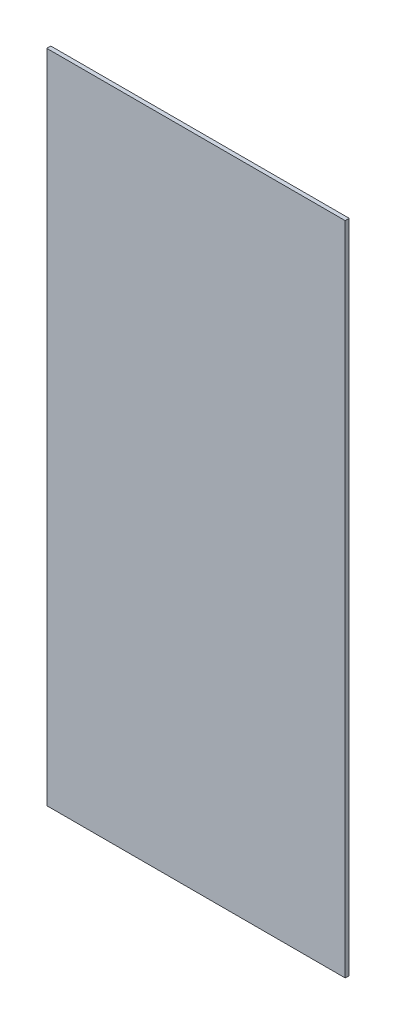
ISO-10303-21;
HEADER;
FILE_DESCRIPTION(('STEP AP214'),'2;1');
FILE_NAME('part.step','',(''),(''),'','','');
FILE_SCHEMA(('AUTOMOTIVE_DESIGN { 1 0 10303 214 1 1 1 1 }'));
ENDSEC;
DATA;
#1=APPLICATION_CONTEXT('core data for automotive mechanical design processes');
#2=APPLICATION_PROTOCOL_DEFINITION('international standard','automotive_design',2000,#1);
#3=PRODUCT_CONTEXT('',#1,'mechanical');
#4=PRODUCT('Part','Part','',(#3));
#5=PRODUCT_RELATED_PRODUCT_CATEGORY('part','',(#4));
#6=PRODUCT_DEFINITION_FORMATION('','',#4);
#7=PRODUCT_DEFINITION_CONTEXT('part definition',#1,'design');
#8=PRODUCT_DEFINITION('design','',#6,#7);
#9=PRODUCT_DEFINITION_SHAPE('','',#8);
#10=(LENGTH_UNIT() NAMED_UNIT(*) SI_UNIT(.MILLI.,.METRE.));
#11=(NAMED_UNIT(*) PLANE_ANGLE_UNIT() SI_UNIT($,.RADIAN.));
#12=(NAMED_UNIT(*) SI_UNIT($,.STERADIAN.) SOLID_ANGLE_UNIT());
#13=UNCERTAINTY_MEASURE_WITH_UNIT(LENGTH_MEASURE(1.E-05),#10,'distance_accuracy_value','');
#14=(GEOMETRIC_REPRESENTATION_CONTEXT(3) GLOBAL_UNCERTAINTY_ASSIGNED_CONTEXT((#13)) GLOBAL_UNIT_ASSIGNED_CONTEXT((#10,
#11,#12)) REPRESENTATION_CONTEXT('',''));
#15=CARTESIAN_POINT('',(0.,0.,0.));
#16=DIRECTION('',(0.,0.,1.));
#17=DIRECTION('',(1.,0.,0.));
#18=AXIS2_PLACEMENT_3D('',#15,#16,#17);
#19=CARTESIAN_POINT('',(114.3,251.1933,3.0734));
#20=DIRECTION('',(-1.,0.,0.));
#21=DIRECTION('',(0.,-1.,0.));
#22=AXIS2_PLACEMENT_3D('',#19,#20,#21);
#23=PLANE('',#22);
#24=DIRECTION('',(0.,1.,0.));
#25=VECTOR('',#24,1.);
#26=CARTESIAN_POINT('',(114.3,251.1933,0.));
#27=LINE('',#26,#25);
#28=CARTESIAN_POINT('',(114.3,-251.1933,0.));
#29=VERTEX_POINT('',#28);
#30=CARTESIAN_POINT('',(114.3,251.1933,0.));
#31=VERTEX_POINT('',#30);
#32=EDGE_CURVE('E96',#29,#31,#27,.T.);
#33=ORIENTED_EDGE('',*,*,#32,.T.);
#34=DIRECTION('',(0.,0.,-1.));
#35=VECTOR('',#34,1.);
#36=CARTESIAN_POINT('',(114.3,251.1933,3.0734));
#37=LINE('',#36,#35);
#38=CARTESIAN_POINT('',(114.3,251.1933,3.0734));
#39=VERTEX_POINT('',#38);
#40=EDGE_CURVE('E11',#39,#31,#37,.T.);
#41=ORIENTED_EDGE('',*,*,#40,.F.);
#42=DIRECTION('',(0.,1.,0.));
#43=VECTOR('',#42,1.);
#44=CARTESIAN_POINT('',(114.3,251.1933,3.0734));
#45=LINE('',#44,#43);
#46=CARTESIAN_POINT('',(114.3,-251.1933,3.0734));
#47=VERTEX_POINT('',#46);
#48=EDGE_CURVE('E84',#47,#39,#45,.T.);
#49=ORIENTED_EDGE('',*,*,#48,.F.);
#50=DIRECTION('',(0.,0.,-1.));
#51=VECTOR('',#50,1.);
#52=CARTESIAN_POINT('',(114.3,-251.1933,3.0734));
#53=LINE('',#52,#51);
#54=EDGE_CURVE('E92',#47,#29,#53,.T.);
#55=ORIENTED_EDGE('',*,*,#54,.T.);
#56=EDGE_LOOP('',(#33,#41,#49,#55));
#57=FACE_BOUND('',#56,.T.);
#58=ADVANCED_FACE('F33',(#57),#23,.F.);
#59=CARTESIAN_POINT('',(-114.3,251.1933,3.0734));
#60=DIRECTION('',(0.,-1.,0.));
#61=DIRECTION('',(0.,0.,-1.));
#62=AXIS2_PLACEMENT_3D('',#59,#60,#61);
#63=PLANE('',#62);
#64=DIRECTION('',(-1.,0.,0.));
#65=VECTOR('',#64,1.);
#66=CARTESIAN_POINT('',(-114.3,251.1933,0.));
#67=LINE('',#66,#65);
#68=CARTESIAN_POINT('',(-114.3,251.1933,0.));
#69=VERTEX_POINT('',#68);
#70=EDGE_CURVE('E88',#31,#69,#67,.T.);
#71=ORIENTED_EDGE('',*,*,#70,.T.);
#72=DIRECTION('',(0.,0.,-1.));
#73=VECTOR('',#72,1.);
#74=CARTESIAN_POINT('',(-114.3,251.1933,3.0734));
#75=LINE('',#74,#73);
#76=CARTESIAN_POINT('',(-114.3,251.1933,3.0734));
#77=VERTEX_POINT('',#76);
#78=EDGE_CURVE('E41',#77,#69,#75,.T.);
#79=ORIENTED_EDGE('',*,*,#78,.F.);
#80=DIRECTION('',(-1.,0.,0.));
#81=VECTOR('',#80,1.);
#82=CARTESIAN_POINT('',(-114.3,251.1933,3.0734));
#83=LINE('',#82,#81);
#84=EDGE_CURVE('E79',#39,#77,#83,.T.);
#85=ORIENTED_EDGE('',*,*,#84,.F.);
#86=ORIENTED_EDGE('',*,*,#40,.T.);
#87=EDGE_LOOP('',(#71,#79,#85,#86));
#88=FACE_BOUND('',#87,.T.);
#89=ADVANCED_FACE('F87',(#88),#63,.F.);
#90=CARTESIAN_POINT('',(-114.3,251.1933,3.0734));
#91=DIRECTION('',(1.,0.,0.));
#92=DIRECTION('',(0.,1.,0.));
#93=AXIS2_PLACEMENT_3D('',#90,#91,#92);
#94=PLANE('',#93);
#95=DIRECTION('',(0.,-1.,0.));
#96=VECTOR('',#95,1.);
#97=CARTESIAN_POINT('',(-114.3,251.1933,0.));
#98=LINE('',#97,#96);
#99=CARTESIAN_POINT('',(-114.3,-251.1933,0.));
#100=VERTEX_POINT('',#99);
#101=EDGE_CURVE('E66',#69,#100,#98,.T.);
#102=ORIENTED_EDGE('',*,*,#101,.T.);
#103=DIRECTION('',(0.,0.,-1.));
#104=VECTOR('',#103,1.);
#105=CARTESIAN_POINT('',(-114.3,-251.1933,3.0734));
#106=LINE('',#105,#104);
#107=CARTESIAN_POINT('',(-114.3,-251.1933,3.0734));
#108=VERTEX_POINT('',#107);
#109=EDGE_CURVE('E89',#108,#100,#106,.T.);
#110=ORIENTED_EDGE('',*,*,#109,.F.);
#111=DIRECTION('',(0.,-1.,0.));
#112=VECTOR('',#111,1.);
#113=CARTESIAN_POINT('',(-114.3,251.1933,3.0734));
#114=LINE('',#113,#112);
#115=EDGE_CURVE('E82',#77,#108,#114,.T.);
#116=ORIENTED_EDGE('',*,*,#115,.F.);
#117=ORIENTED_EDGE('',*,*,#78,.T.);
#118=EDGE_LOOP('',(#102,#110,#116,#117));
#119=FACE_BOUND('',#118,.T.);
#120=ADVANCED_FACE('F90',(#119),#94,.F.);
#121=CARTESIAN_POINT('',(-114.3,-251.1933,3.0734));
#122=DIRECTION('',(0.,1.,0.));
#123=DIRECTION('',(0.,0.,1.));
#124=AXIS2_PLACEMENT_3D('',#121,#122,#123);
#125=PLANE('',#124);
#126=DIRECTION('',(1.,0.,0.));
#127=VECTOR('',#126,1.);
#128=CARTESIAN_POINT('',(-114.3,-251.1933,0.));
#129=LINE('',#128,#127);
#130=EDGE_CURVE('E72',#100,#29,#129,.T.);
#131=ORIENTED_EDGE('',*,*,#130,.T.);
#132=ORIENTED_EDGE('',*,*,#54,.F.);
#133=DIRECTION('',(1.,0.,0.));
#134=VECTOR('',#133,1.);
#135=CARTESIAN_POINT('',(-114.3,-251.1933,3.0734));
#136=LINE('',#135,#134);
#137=EDGE_CURVE('E49',#108,#47,#136,.T.);
#138=ORIENTED_EDGE('',*,*,#137,.F.);
#139=ORIENTED_EDGE('',*,*,#109,.T.);
#140=EDGE_LOOP('',(#131,#132,#138,#139));
#141=FACE_BOUND('',#140,.T.);
#142=ADVANCED_FACE('F103',(#141),#125,.F.);
#143=CARTESIAN_POINT('',(0.,0.,3.0734));
#144=DIRECTION('',(0.,0.,1.));
#145=DIRECTION('',(1.,0.,0.));
#146=AXIS2_PLACEMENT_3D('',#143,#144,#145);
#147=PLANE('',#146);
#148=ORIENTED_EDGE('',*,*,#48,.T.);
#149=ORIENTED_EDGE('',*,*,#84,.T.);
#150=ORIENTED_EDGE('',*,*,#115,.T.);
#151=ORIENTED_EDGE('',*,*,#137,.T.);
#152=EDGE_LOOP('',(#148,#149,#150,#151));
#153=FACE_BOUND('',#152,.T.);
#154=ADVANCED_FACE('F80',(#153),#147,.T.);
#155=CARTESIAN_POINT('',(0.,0.,0.));
#156=DIRECTION('',(0.,0.,1.));
#157=DIRECTION('',(1.,0.,0.));
#158=AXIS2_PLACEMENT_3D('',#155,#156,#157);
#159=PLANE('',#158);
#160=ORIENTED_EDGE('',*,*,#32,.F.);
#161=ORIENTED_EDGE('',*,*,#130,.F.);
#162=ORIENTED_EDGE('',*,*,#101,.F.);
#163=ORIENTED_EDGE('',*,*,#70,.F.);
#164=EDGE_LOOP('',(#160,#161,#162,#163));
#165=FACE_BOUND('',#164,.T.);
#166=ADVANCED_FACE('F106',(#165),#159,.F.);
#167=CLOSED_SHELL('',(#58,#89,#120,#142,#154,#166));
#168=MANIFOLD_SOLID_BREP('B2',#167);
#169=ADVANCED_BREP_SHAPE_REPRESENTATION('',(#18,#168),#14);
#170=SHAPE_DEFINITION_REPRESENTATION(#9,#169);
ENDSEC;
END-ISO-10303-21;
